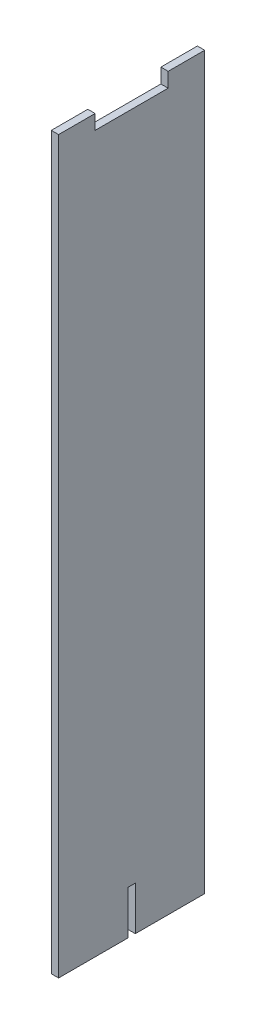
ISO-10303-21;
HEADER;
FILE_DESCRIPTION(('STEP AP214'),'2;1');
FILE_NAME('part.step','',(''),(''),'','','');
FILE_SCHEMA(('AUTOMOTIVE_DESIGN { 1 0 10303 214 1 1 1 1 }'));
ENDSEC;
DATA;
#1=APPLICATION_CONTEXT('core data for automotive mechanical design processes');
#2=APPLICATION_PROTOCOL_DEFINITION('international standard','automotive_design',2000,#1);
#3=PRODUCT_CONTEXT('',#1,'mechanical');
#4=PRODUCT('Part','Part','',(#3));
#5=PRODUCT_RELATED_PRODUCT_CATEGORY('part','',(#4));
#6=PRODUCT_DEFINITION_FORMATION('','',#4);
#7=PRODUCT_DEFINITION_CONTEXT('part definition',#1,'design');
#8=PRODUCT_DEFINITION('design','',#6,#7);
#9=PRODUCT_DEFINITION_SHAPE('','',#8);
#10=(LENGTH_UNIT() NAMED_UNIT(*) SI_UNIT(.MILLI.,.METRE.));
#11=(NAMED_UNIT(*) PLANE_ANGLE_UNIT() SI_UNIT($,.RADIAN.));
#12=(NAMED_UNIT(*) SI_UNIT($,.STERADIAN.) SOLID_ANGLE_UNIT());
#13=UNCERTAINTY_MEASURE_WITH_UNIT(LENGTH_MEASURE(1.E-05),#10,'distance_accuracy_value','');
#14=(GEOMETRIC_REPRESENTATION_CONTEXT(3) GLOBAL_UNCERTAINTY_ASSIGNED_CONTEXT((#13)) GLOBAL_UNIT_ASSIGNED_CONTEXT((#10,
#11,#12)) REPRESENTATION_CONTEXT('',''));
#15=CARTESIAN_POINT('',(0.,0.,0.));
#16=DIRECTION('',(0.,0.,1.));
#17=DIRECTION('',(1.,0.,0.));
#18=AXIS2_PLACEMENT_3D('',#15,#16,#17);
#19=CARTESIAN_POINT('',(10.,16.2637362637363,-100.));
#20=DIRECTION('',(0.,-1.,0.));
#21=DIRECTION('',(0.,0.,-1.));
#22=AXIS2_PLACEMENT_3D('',#19,#20,#21);
#23=PLANE('',#22);
#24=DIRECTION('',(0.,0.,1.));
#25=VECTOR('',#24,1.);
#26=CARTESIAN_POINT('',(10.,16.2637362637363,-100.));
#27=LINE('',#26,#25);
#28=CARTESIAN_POINT('',(10.,16.2637362637363,50.));
#29=VERTEX_POINT('',#28);
#30=CARTESIAN_POINT('',(10.,16.2637362637363,100.));
#31=VERTEX_POINT('',#30);
#32=EDGE_CURVE('E57',#29,#31,#27,.T.);
#33=ORIENTED_EDGE('',*,*,#32,.F.);
#34=DIRECTION('',(-1.,0.,0.));
#35=VECTOR('',#34,1.);
#36=CARTESIAN_POINT('',(10.,16.2637362637363,50.));
#37=LINE('',#36,#35);
#38=CARTESIAN_POINT('',(0.,16.2637362637363,50.));
#39=VERTEX_POINT('',#38);
#40=EDGE_CURVE('E151',#29,#39,#37,.T.);
#41=ORIENTED_EDGE('',*,*,#40,.T.);
#42=DIRECTION('',(0.,0.,1.));
#43=VECTOR('',#42,1.);
#44=CARTESIAN_POINT('',(0.,16.2637362637363,-100.));
#45=LINE('',#44,#43);
#46=CARTESIAN_POINT('',(0.,16.2637362637363,100.));
#47=VERTEX_POINT('',#46);
#48=EDGE_CURVE('E91',#39,#47,#45,.T.);
#49=ORIENTED_EDGE('',*,*,#48,.T.);
#50=DIRECTION('',(-1.,0.,0.));
#51=VECTOR('',#50,1.);
#52=CARTESIAN_POINT('',(10.,16.2637362637363,100.));
#53=LINE('',#52,#51);
#54=EDGE_CURVE('E146',#31,#47,#53,.T.);
#55=ORIENTED_EDGE('',*,*,#54,.F.);
#56=EDGE_LOOP('',(#33,#41,#49,#55));
#57=FACE_BOUND('',#56,.T.);
#58=ADVANCED_FACE('F33',(#57),#23,.F.);
#59=CARTESIAN_POINT('',(10.,16.2637362637363,100.));
#60=DIRECTION('',(0.,0.,-1.));
#61=DIRECTION('',(0.,1.,0.));
#62=AXIS2_PLACEMENT_3D('',#59,#60,#61);
#63=PLANE('',#62);
#64=DIRECTION('',(0.,-1.,0.));
#65=VECTOR('',#64,1.);
#66=CARTESIAN_POINT('',(0.,16.2637362637363,100.));
#67=LINE('',#66,#65);
#68=CARTESIAN_POINT('',(0.,-983.736263736264,99.9999999999999));
#69=VERTEX_POINT('',#68);
#70=EDGE_CURVE('E147',#47,#69,#67,.T.);
#71=ORIENTED_EDGE('',*,*,#70,.T.);
#72=DIRECTION('',(-1.,0.,0.));
#73=VECTOR('',#72,1.);
#74=CARTESIAN_POINT('',(10.,-983.736263736264,99.9999999999999));
#75=LINE('',#74,#73);
#76=CARTESIAN_POINT('',(10.,-983.736263736264,99.9999999999999));
#77=VERTEX_POINT('',#76);
#78=EDGE_CURVE('E11',#77,#69,#75,.T.);
#79=ORIENTED_EDGE('',*,*,#78,.F.);
#80=DIRECTION('',(0.,-1.,0.));
#81=VECTOR('',#80,1.);
#82=CARTESIAN_POINT('',(10.,16.2637362637363,100.));
#83=LINE('',#82,#81);
#84=EDGE_CURVE('E165',#31,#77,#83,.T.);
#85=ORIENTED_EDGE('',*,*,#84,.F.);
#86=ORIENTED_EDGE('',*,*,#54,.T.);
#87=EDGE_LOOP('',(#71,#79,#85,#86));
#88=FACE_BOUND('',#87,.T.);
#89=ADVANCED_FACE('F35',(#88),#63,.F.);
#90=CARTESIAN_POINT('',(10.,-983.736263736264,99.9999999999999));
#91=DIRECTION('',(0.,1.,0.));
#92=DIRECTION('',(0.,0.,1.));
#93=AXIS2_PLACEMENT_3D('',#90,#91,#92);
#94=PLANE('',#93);
#95=DIRECTION('',(0.,0.,-1.));
#96=VECTOR('',#95,1.);
#97=CARTESIAN_POINT('',(0.,-983.736263736264,99.9999999999999));
#98=LINE('',#97,#96);
#99=CARTESIAN_POINT('',(0.,-983.736263736264,4.99999999999999));
#100=VERTEX_POINT('',#99);
#101=EDGE_CURVE('E150',#69,#100,#98,.T.);
#102=ORIENTED_EDGE('',*,*,#101,.T.);
#103=DIRECTION('',(-1.,0.,0.));
#104=VECTOR('',#103,1.);
#105=CARTESIAN_POINT('',(10.,-983.736263736264,4.99999999999999));
#106=LINE('',#105,#104);
#107=CARTESIAN_POINT('',(10.,-983.736263736264,4.99999999999999));
#108=VERTEX_POINT('',#107);
#109=EDGE_CURVE('E41',#108,#100,#106,.T.);
#110=ORIENTED_EDGE('',*,*,#109,.F.);
#111=DIRECTION('',(0.,0.,-1.));
#112=VECTOR('',#111,1.);
#113=CARTESIAN_POINT('',(10.,-983.736263736264,99.9999999999999));
#114=LINE('',#113,#112);
#115=EDGE_CURVE('E99',#77,#108,#114,.T.);
#116=ORIENTED_EDGE('',*,*,#115,.F.);
#117=ORIENTED_EDGE('',*,*,#78,.T.);
#118=EDGE_LOOP('',(#102,#110,#116,#117));
#119=FACE_BOUND('',#118,.T.);
#120=ADVANCED_FACE('F249',(#119),#94,.F.);
#121=CARTESIAN_POINT('',(10.,-983.736263736264,4.99999999999999));
#122=DIRECTION('',(0.,0.,1.));
#123=DIRECTION('',(0.,-1.,0.));
#124=AXIS2_PLACEMENT_3D('',#121,#122,#123);
#125=PLANE('',#124);
#126=DIRECTION('',(0.,1.,0.));
#127=VECTOR('',#126,1.);
#128=CARTESIAN_POINT('',(0.,-983.736263736264,4.99999999999999));
#129=LINE('',#128,#127);
#130=CARTESIAN_POINT('',(0.,-923.736263736264,4.99999999999971));
#131=VERTEX_POINT('',#130);
#132=EDGE_CURVE('E153',#100,#131,#129,.T.);
#133=ORIENTED_EDGE('',*,*,#132,.T.);
#134=DIRECTION('',(-1.,0.,0.));
#135=VECTOR('',#134,1.);
#136=CARTESIAN_POINT('',(10.,-923.736263736264,4.99999999999971));
#137=LINE('',#136,#135);
#138=CARTESIAN_POINT('',(10.,-923.736263736264,4.99999999999971));
#139=VERTEX_POINT('',#138);
#140=EDGE_CURVE('E172',#139,#131,#137,.T.);
#141=ORIENTED_EDGE('',*,*,#140,.F.);
#142=DIRECTION('',(0.,1.,0.));
#143=VECTOR('',#142,1.);
#144=CARTESIAN_POINT('',(10.,-983.736263736264,4.99999999999999));
#145=LINE('',#144,#143);
#146=EDGE_CURVE('E180',#108,#139,#145,.T.);
#147=ORIENTED_EDGE('',*,*,#146,.F.);
#148=ORIENTED_EDGE('',*,*,#109,.T.);
#149=EDGE_LOOP('',(#133,#141,#147,#148));
#150=FACE_BOUND('',#149,.T.);
#151=ADVANCED_FACE('F178',(#150),#125,.F.);
#152=CARTESIAN_POINT('',(10.,-923.736263736264,4.99999999999971));
#153=DIRECTION('',(0.,1.,0.));
#154=DIRECTION('',(0.,0.,1.));
#155=AXIS2_PLACEMENT_3D('',#152,#153,#154);
#156=PLANE('',#155);
#157=DIRECTION('',(0.,0.,-1.));
#158=VECTOR('',#157,1.);
#159=CARTESIAN_POINT('',(0.,-923.736263736264,4.99999999999971));
#160=LINE('',#159,#158);
#161=CARTESIAN_POINT('',(0.,-923.736263736264,-4.99999999999994));
#162=VERTEX_POINT('',#161);
#163=EDGE_CURVE('E155',#131,#162,#160,.T.);
#164=ORIENTED_EDGE('',*,*,#163,.T.);
#165=DIRECTION('',(-1.,0.,0.));
#166=VECTOR('',#165,1.);
#167=CARTESIAN_POINT('',(10.,-923.736263736264,-4.99999999999994));
#168=LINE('',#167,#166);
#169=CARTESIAN_POINT('',(10.,-923.736263736264,-4.99999999999994));
#170=VERTEX_POINT('',#169);
#171=EDGE_CURVE('E169',#170,#162,#168,.T.);
#172=ORIENTED_EDGE('',*,*,#171,.F.);
#173=DIRECTION('',(0.,0.,-1.));
#174=VECTOR('',#173,1.);
#175=CARTESIAN_POINT('',(10.,-923.736263736264,4.99999999999971));
#176=LINE('',#175,#174);
#177=EDGE_CURVE('E192',#139,#170,#176,.T.);
#178=ORIENTED_EDGE('',*,*,#177,.F.);
#179=ORIENTED_EDGE('',*,*,#140,.T.);
#180=EDGE_LOOP('',(#164,#172,#178,#179));
#181=FACE_BOUND('',#180,.T.);
#182=ADVANCED_FACE('F188',(#181),#156,.F.);
#183=CARTESIAN_POINT('',(10.,-983.736263736264,-5.00000000000024));
#184=DIRECTION('',(0.,0.,-1.));
#185=DIRECTION('',(0.,1.,0.));
#186=AXIS2_PLACEMENT_3D('',#183,#184,#185);
#187=PLANE('',#186);
#188=DIRECTION('',(0.,-1.,0.));
#189=VECTOR('',#188,1.);
#190=CARTESIAN_POINT('',(0.,-983.736263736264,-5.00000000000024));
#191=LINE('',#190,#189);
#192=CARTESIAN_POINT('',(0.,-983.736263736264,-5.00000000000024));
#193=VERTEX_POINT('',#192);
#194=EDGE_CURVE('E157',#162,#193,#191,.T.);
#195=ORIENTED_EDGE('',*,*,#194,.T.);
#196=DIRECTION('',(-1.,0.,0.));
#197=VECTOR('',#196,1.);
#198=CARTESIAN_POINT('',(10.,-983.736263736264,-5.00000000000024));
#199=LINE('',#198,#197);
#200=CARTESIAN_POINT('',(10.,-983.736263736264,-5.00000000000024));
#201=VERTEX_POINT('',#200);
#202=EDGE_CURVE('E135',#201,#193,#199,.T.);
#203=ORIENTED_EDGE('',*,*,#202,.F.);
#204=DIRECTION('',(0.,-1.,0.));
#205=VECTOR('',#204,1.);
#206=CARTESIAN_POINT('',(10.,-983.736263736264,-5.00000000000024));
#207=LINE('',#206,#205);
#208=EDGE_CURVE('E123',#170,#201,#207,.T.);
#209=ORIENTED_EDGE('',*,*,#208,.F.);
#210=ORIENTED_EDGE('',*,*,#171,.T.);
#211=EDGE_LOOP('',(#195,#203,#209,#210));
#212=FACE_BOUND('',#211,.T.);
#213=ADVANCED_FACE('F191',(#212),#187,.F.);
#214=CARTESIAN_POINT('',(10.,-983.736263736264,-100.));
#215=DIRECTION('',(0.,1.,0.));
#216=DIRECTION('',(0.,0.,1.));
#217=AXIS2_PLACEMENT_3D('',#214,#215,#216);
#218=PLANE('',#217);
#219=DIRECTION('',(0.,0.,-1.));
#220=VECTOR('',#219,1.);
#221=CARTESIAN_POINT('',(0.,-983.736263736264,-100.));
#222=LINE('',#221,#220);
#223=CARTESIAN_POINT('',(0.,-983.736263736264,-100.));
#224=VERTEX_POINT('',#223);
#225=EDGE_CURVE('E132',#193,#224,#222,.T.);
#226=ORIENTED_EDGE('',*,*,#225,.T.);
#227=DIRECTION('',(-1.,0.,0.));
#228=VECTOR('',#227,1.);
#229=CARTESIAN_POINT('',(10.,-983.736263736264,-100.));
#230=LINE('',#229,#228);
#231=CARTESIAN_POINT('',(10.,-983.736263736264,-100.));
#232=VERTEX_POINT('',#231);
#233=EDGE_CURVE('E129',#232,#224,#230,.T.);
#234=ORIENTED_EDGE('',*,*,#233,.F.);
#235=DIRECTION('',(0.,0.,-1.));
#236=VECTOR('',#235,1.);
#237=CARTESIAN_POINT('',(10.,-983.736263736264,-100.));
#238=LINE('',#237,#236);
#239=EDGE_CURVE('E115',#201,#232,#238,.T.);
#240=ORIENTED_EDGE('',*,*,#239,.F.);
#241=ORIENTED_EDGE('',*,*,#202,.T.);
#242=EDGE_LOOP('',(#226,#234,#240,#241));
#243=FACE_BOUND('',#242,.T.);
#244=ADVANCED_FACE('F130',(#243),#218,.F.);
#245=CARTESIAN_POINT('',(10.,16.2637362637363,-100.));
#246=DIRECTION('',(0.,0.,1.));
#247=DIRECTION('',(0.,-1.,0.));
#248=AXIS2_PLACEMENT_3D('',#245,#246,#247);
#249=PLANE('',#248);
#250=DIRECTION('',(0.,1.,0.));
#251=VECTOR('',#250,1.);
#252=CARTESIAN_POINT('',(0.,16.2637362637363,-100.));
#253=LINE('',#252,#251);
#254=CARTESIAN_POINT('',(0.,16.2637362637363,-100.));
#255=VERTEX_POINT('',#254);
#256=EDGE_CURVE('E160',#224,#255,#253,.T.);
#257=ORIENTED_EDGE('',*,*,#256,.T.);
#258=DIRECTION('',(-1.,0.,0.));
#259=VECTOR('',#258,1.);
#260=CARTESIAN_POINT('',(10.,16.2637362637363,-100.));
#261=LINE('',#260,#259);
#262=CARTESIAN_POINT('',(10.,16.2637362637363,-100.));
#263=VERTEX_POINT('',#262);
#264=EDGE_CURVE('E136',#263,#255,#261,.T.);
#265=ORIENTED_EDGE('',*,*,#264,.F.);
#266=DIRECTION('',(0.,1.,0.));
#267=VECTOR('',#266,1.);
#268=CARTESIAN_POINT('',(10.,16.2637362637363,-100.));
#269=LINE('',#268,#267);
#270=EDGE_CURVE('E120',#232,#263,#269,.T.);
#271=ORIENTED_EDGE('',*,*,#270,.F.);
#272=ORIENTED_EDGE('',*,*,#233,.T.);
#273=EDGE_LOOP('',(#257,#265,#271,#272));
#274=FACE_BOUND('',#273,.T.);
#275=ADVANCED_FACE('F138',(#274),#249,.F.);
#276=CARTESIAN_POINT('',(0.,16.2637362637363,-50.));
#277=VERTEX_POINT('',#276);
#278=EDGE_CURVE('E162',#255,#277,#45,.T.);
#279=ORIENTED_EDGE('',*,*,#278,.T.);
#280=DIRECTION('',(-1.,0.,0.));
#281=VECTOR('',#280,1.);
#282=CARTESIAN_POINT('',(10.,16.2637362637363,-50.));
#283=LINE('',#282,#281);
#284=CARTESIAN_POINT('',(10.,16.2637362637363,-50.));
#285=VERTEX_POINT('',#284);
#286=EDGE_CURVE('E48',#285,#277,#283,.T.);
#287=ORIENTED_EDGE('',*,*,#286,.F.);
#288=EDGE_CURVE('E142',#263,#285,#27,.T.);
#289=ORIENTED_EDGE('',*,*,#288,.F.);
#290=ORIENTED_EDGE('',*,*,#264,.T.);
#291=EDGE_LOOP('',(#279,#287,#289,#290));
#292=FACE_BOUND('',#291,.T.);
#293=ADVANCED_FACE('F230',(#292),#23,.F.);
#294=CARTESIAN_POINT('',(10.,0.,0.));
#295=DIRECTION('',(1.,0.,0.));
#296=DIRECTION('',(0.,0.,-1.));
#297=AXIS2_PLACEMENT_3D('',#294,#295,#296);
#298=PLANE('',#297);
#299=DIRECTION('',(0.,1.,0.));
#300=VECTOR('',#299,1.);
#301=CARTESIAN_POINT('',(10.,-3.73626373626372,50.));
#302=LINE('',#301,#300);
#303=CARTESIAN_POINT('',(10.,-3.73626373626372,50.));
#304=VERTEX_POINT('',#303);
#305=EDGE_CURVE('E200',#304,#29,#302,.T.);
#306=ORIENTED_EDGE('',*,*,#305,.T.);
#307=ORIENTED_EDGE('',*,*,#32,.T.);
#308=ORIENTED_EDGE('',*,*,#84,.T.);
#309=ORIENTED_EDGE('',*,*,#115,.T.);
#310=ORIENTED_EDGE('',*,*,#146,.T.);
#311=ORIENTED_EDGE('',*,*,#177,.T.);
#312=ORIENTED_EDGE('',*,*,#208,.T.);
#313=ORIENTED_EDGE('',*,*,#239,.T.);
#314=ORIENTED_EDGE('',*,*,#270,.T.);
#315=ORIENTED_EDGE('',*,*,#288,.T.);
#316=DIRECTION('',(0.,-1.,0.));
#317=VECTOR('',#316,1.);
#318=CARTESIAN_POINT('',(10.,16.2637362637363,-50.));
#319=LINE('',#318,#317);
#320=CARTESIAN_POINT('',(10.,-3.73626373626372,-50.));
#321=VERTEX_POINT('',#320);
#322=EDGE_CURVE('E210',#285,#321,#319,.T.);
#323=ORIENTED_EDGE('',*,*,#322,.T.);
#324=DIRECTION('',(0.,0.,1.));
#325=VECTOR('',#324,1.);
#326=CARTESIAN_POINT('',(10.,-3.73626373626372,-50.));
#327=LINE('',#326,#325);
#328=EDGE_CURVE('E217',#321,#304,#327,.T.);
#329=ORIENTED_EDGE('',*,*,#328,.T.);
#330=EDGE_LOOP('',(#306,#307,#308,#309,#310,#311,#312,#313,#314,#315,#323,#329));
#331=FACE_BOUND('',#330,.T.);
#332=ADVANCED_FACE('F117',(#331),#298,.T.);
#333=CARTESIAN_POINT('',(0.,0.,0.));
#334=DIRECTION('',(1.,0.,0.));
#335=DIRECTION('',(0.,0.,-1.));
#336=AXIS2_PLACEMENT_3D('',#333,#334,#335);
#337=PLANE('',#336);
#338=ORIENTED_EDGE('',*,*,#48,.F.);
#339=DIRECTION('',(0.,1.,0.));
#340=VECTOR('',#339,1.);
#341=CARTESIAN_POINT('',(0.,-3.73626373626372,50.));
#342=LINE('',#341,#340);
#343=CARTESIAN_POINT('',(0.,-3.73626373626372,50.));
#344=VERTEX_POINT('',#343);
#345=EDGE_CURVE('E207',#344,#39,#342,.T.);
#346=ORIENTED_EDGE('',*,*,#345,.F.);
#347=DIRECTION('',(0.,0.,1.));
#348=VECTOR('',#347,1.);
#349=CARTESIAN_POINT('',(0.,-3.73626373626372,-50.));
#350=LINE('',#349,#348);
#351=CARTESIAN_POINT('',(0.,-3.73626373626372,-50.));
#352=VERTEX_POINT('',#351);
#353=EDGE_CURVE('E211',#352,#344,#350,.T.);
#354=ORIENTED_EDGE('',*,*,#353,.F.);
#355=DIRECTION('',(0.,-1.,0.));
#356=VECTOR('',#355,1.);
#357=CARTESIAN_POINT('',(0.,16.2637362637363,-50.));
#358=LINE('',#357,#356);
#359=EDGE_CURVE('E214',#277,#352,#358,.T.);
#360=ORIENTED_EDGE('',*,*,#359,.F.);
#361=ORIENTED_EDGE('',*,*,#278,.F.);
#362=ORIENTED_EDGE('',*,*,#256,.F.);
#363=ORIENTED_EDGE('',*,*,#225,.F.);
#364=ORIENTED_EDGE('',*,*,#194,.F.);
#365=ORIENTED_EDGE('',*,*,#163,.F.);
#366=ORIENTED_EDGE('',*,*,#132,.F.);
#367=ORIENTED_EDGE('',*,*,#101,.F.);
#368=ORIENTED_EDGE('',*,*,#70,.F.);
#369=EDGE_LOOP('',(#338,#346,#354,#360,#361,#362,#363,#364,#365,#366,#367,#368));
#370=FACE_BOUND('',#369,.T.);
#371=ADVANCED_FACE('F183',(#370),#337,.F.);
#372=CARTESIAN_POINT('',(10.,-3.73626373626372,50.));
#373=DIRECTION('',(0.,0.,1.));
#374=DIRECTION('',(0.,-1.,0.));
#375=AXIS2_PLACEMENT_3D('',#372,#373,#374);
#376=PLANE('',#375);
#377=ORIENTED_EDGE('',*,*,#345,.T.);
#378=ORIENTED_EDGE('',*,*,#40,.F.);
#379=ORIENTED_EDGE('',*,*,#305,.F.);
#380=DIRECTION('',(-1.,0.,0.));
#381=VECTOR('',#380,1.);
#382=CARTESIAN_POINT('',(10.,-3.73626373626372,50.));
#383=LINE('',#382,#381);
#384=EDGE_CURVE('E203',#304,#344,#383,.T.);
#385=ORIENTED_EDGE('',*,*,#384,.T.);
#386=EDGE_LOOP('',(#377,#378,#379,#385));
#387=FACE_BOUND('',#386,.T.);
#388=ADVANCED_FACE('F245',(#387),#376,.F.);
#389=CARTESIAN_POINT('',(10.,-3.73626373626372,-50.));
#390=DIRECTION('',(0.,-1.,0.));
#391=DIRECTION('',(0.,0.,-1.));
#392=AXIS2_PLACEMENT_3D('',#389,#390,#391);
#393=PLANE('',#392);
#394=ORIENTED_EDGE('',*,*,#353,.T.);
#395=ORIENTED_EDGE('',*,*,#384,.F.);
#396=ORIENTED_EDGE('',*,*,#328,.F.);
#397=DIRECTION('',(-1.,0.,0.));
#398=VECTOR('',#397,1.);
#399=CARTESIAN_POINT('',(10.,-3.73626373626372,-50.));
#400=LINE('',#399,#398);
#401=EDGE_CURVE('E199',#321,#352,#400,.T.);
#402=ORIENTED_EDGE('',*,*,#401,.T.);
#403=EDGE_LOOP('',(#394,#395,#396,#402));
#404=FACE_BOUND('',#403,.T.);
#405=ADVANCED_FACE('F243',(#404),#393,.F.);
#406=CARTESIAN_POINT('',(10.,16.2637362637363,-50.));
#407=DIRECTION('',(0.,0.,-1.));
#408=DIRECTION('',(0.,1.,0.));
#409=AXIS2_PLACEMENT_3D('',#406,#407,#408);
#410=PLANE('',#409);
#411=ORIENTED_EDGE('',*,*,#359,.T.);
#412=ORIENTED_EDGE('',*,*,#401,.F.);
#413=ORIENTED_EDGE('',*,*,#322,.F.);
#414=ORIENTED_EDGE('',*,*,#286,.T.);
#415=EDGE_LOOP('',(#411,#412,#413,#414));
#416=FACE_BOUND('',#415,.T.);
#417=ADVANCED_FACE('F227',(#416),#410,.F.);
#418=CLOSED_SHELL('',(#58,#89,#120,#151,#182,#213,#244,#275,#293,#332,#371,#388,#405,#417));
#419=MANIFOLD_SOLID_BREP('B2',#418);
#420=ADVANCED_BREP_SHAPE_REPRESENTATION('',(#18,#419),#14);
#421=SHAPE_DEFINITION_REPRESENTATION(#9,#420);
ENDSEC;
END-ISO-10303-21;
